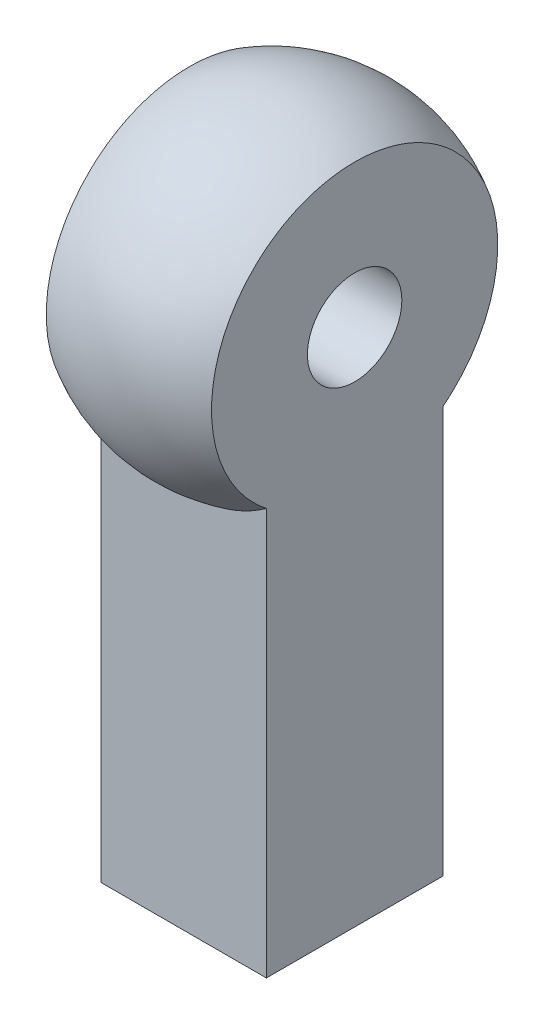
ISO-10303-21;
HEADER;
FILE_DESCRIPTION(('STEP AP214'),'2;1');
FILE_NAME('part.step','',(''),(''),'','','');
FILE_SCHEMA(('AUTOMOTIVE_DESIGN { 1 0 10303 214 1 1 1 1 }'));
ENDSEC;
DATA;
#1=APPLICATION_CONTEXT('core data for automotive mechanical design processes');
#2=APPLICATION_PROTOCOL_DEFINITION('international standard','automotive_design',2000,#1);
#3=PRODUCT_CONTEXT('',#1,'mechanical');
#4=PRODUCT('Part','Part','',(#3));
#5=PRODUCT_RELATED_PRODUCT_CATEGORY('part','',(#4));
#6=PRODUCT_DEFINITION_FORMATION('','',#4);
#7=PRODUCT_DEFINITION_CONTEXT('part definition',#1,'design');
#8=PRODUCT_DEFINITION('design','',#6,#7);
#9=PRODUCT_DEFINITION_SHAPE('','',#8);
#10=(LENGTH_UNIT() NAMED_UNIT(*) SI_UNIT(.MILLI.,.METRE.));
#11=(NAMED_UNIT(*) PLANE_ANGLE_UNIT() SI_UNIT($,.RADIAN.));
#12=(NAMED_UNIT(*) SI_UNIT($,.STERADIAN.) SOLID_ANGLE_UNIT());
#13=UNCERTAINTY_MEASURE_WITH_UNIT(LENGTH_MEASURE(1.E-05),#10,'distance_accuracy_value','');
#14=(GEOMETRIC_REPRESENTATION_CONTEXT(3) GLOBAL_UNCERTAINTY_ASSIGNED_CONTEXT((#13)) GLOBAL_UNIT_ASSIGNED_CONTEXT((#10,
#11,#12)) REPRESENTATION_CONTEXT('',''));
#15=CARTESIAN_POINT('',(0.,0.,0.));
#16=DIRECTION('',(0.,0.,1.));
#17=DIRECTION('',(1.,0.,0.));
#18=AXIS2_PLACEMENT_3D('',#15,#16,#17);
#19=CARTESIAN_POINT('',(0.,0.,0.));
#20=DIRECTION('',(0.,1.,0.));
#21=DIRECTION('',(0.,0.,-1.));
#22=AXIS2_PLACEMENT_3D('',#19,#20,#21);
#23=SPHERICAL_SURFACE('',#22,7.);
#24=CARTESIAN_POINT('',(0.,0.,3.7379727377111));
#25=DIRECTION('',(0.,0.,1.));
#26=DIRECTION('',(1.,0.,0.));
#27=AXIS2_PLACEMENT_3D('',#24,#25,#26);
#28=CIRCLE('',#27,5.91840855400577);
#29=CARTESIAN_POINT('',(3.5,-4.77258418596557,3.7379727377111));
#30=VERTEX_POINT('',#29);
#31=CARTESIAN_POINT('',(-3.5,-4.77258418596557,3.7379727377111));
#32=VERTEX_POINT('',#31);
#33=EDGE_CURVE('E110',#30,#32,#28,.F.);
#34=ORIENTED_EDGE('',*,*,#33,.F.);
#35=CARTESIAN_POINT('',(3.5,0.,0.));
#36=DIRECTION('',(1.,0.,0.));
#37=DIRECTION('',(0.,0.,-1.));
#38=AXIS2_PLACEMENT_3D('',#35,#36,#37);
#39=CIRCLE('',#38,6.06217782649107);
#40=CARTESIAN_POINT('',(3.5,-4.77258418596556,-3.7379727377111));
#41=VERTEX_POINT('',#40);
#42=EDGE_CURVE('E12',#30,#41,#39,.F.);
#43=ORIENTED_EDGE('',*,*,#42,.T.);
#44=CARTESIAN_POINT('',(0.,0.,-3.7379727377111));
#45=DIRECTION('',(0.,0.,-1.));
#46=DIRECTION('',(-1.,0.,0.));
#47=AXIS2_PLACEMENT_3D('',#44,#45,#46);
#48=CIRCLE('',#47,5.91840855400576);
#49=CARTESIAN_POINT('',(-3.5,-4.77258418596556,-3.7379727377111));
#50=VERTEX_POINT('',#49);
#51=EDGE_CURVE('E49',#50,#41,#48,.F.);
#52=ORIENTED_EDGE('',*,*,#51,.F.);
#53=CARTESIAN_POINT('',(-3.5,0.,0.));
#54=DIRECTION('',(-1.,0.,0.));
#55=DIRECTION('',(0.,0.,1.));
#56=AXIS2_PLACEMENT_3D('',#53,#54,#55);
#57=CIRCLE('',#56,6.06217782649107);
#58=EDGE_CURVE('E43',#50,#32,#57,.F.);
#59=ORIENTED_EDGE('',*,*,#58,.T.);
#60=EDGE_LOOP('',(#34,#43,#52,#59));
#61=FACE_BOUND('',#60,.T.);
#62=ADVANCED_FACE('F35',(#61),#23,.T.);
#63=CARTESIAN_POINT('',(-3.5,-29.4774502017861,-7.));
#64=DIRECTION('',(-1.,0.,0.));
#65=DIRECTION('',(0.,0.,1.));
#66=AXIS2_PLACEMENT_3D('',#63,#64,#65);
#67=PLANE('',#66);
#68=ORIENTED_EDGE('',*,*,#58,.F.);
#69=DIRECTION('',(0.,1.,0.));
#70=VECTOR('',#69,1.);
#71=CARTESIAN_POINT('',(-3.5,-4.24003846631764,-3.7379727377111));
#72=LINE('',#71,#70);
#73=CARTESIAN_POINT('',(-3.5,-22.,-3.7379727377111));
#74=VERTEX_POINT('',#73);
#75=EDGE_CURVE('E83',#74,#50,#72,.T.);
#76=ORIENTED_EDGE('',*,*,#75,.F.);
#77=DIRECTION('',(0.,0.,-1.));
#78=VECTOR('',#77,1.);
#79=CARTESIAN_POINT('',(-3.5,-22.,3.7379727377111));
#80=LINE('',#79,#78);
#81=CARTESIAN_POINT('',(-3.5,-22.,3.7379727377111));
#82=VERTEX_POINT('',#81);
#83=EDGE_CURVE('E80',#82,#74,#80,.T.);
#84=ORIENTED_EDGE('',*,*,#83,.F.);
#85=DIRECTION('',(0.,-1.,0.));
#86=VECTOR('',#85,1.);
#87=CARTESIAN_POINT('',(-3.5,-4.24003846631764,3.7379727377111));
#88=LINE('',#87,#86);
#89=EDGE_CURVE('E97',#32,#82,#88,.T.);
#90=ORIENTED_EDGE('',*,*,#89,.F.);
#91=EDGE_LOOP('',(#68,#76,#84,#90));
#92=FACE_BOUND('',#91,.T.);
#93=CARTESIAN_POINT('',(-3.5,0.,0.));
#94=DIRECTION('',(1.,0.,0.));
#95=DIRECTION('',(0.,0.,-1.));
#96=AXIS2_PLACEMENT_3D('',#93,#94,#95);
#97=CIRCLE('',#96,2.);
#98=CARTESIAN_POINT('',(-3.5,0.,-2.));
#99=VERTEX_POINT('',#98);
#100=EDGE_CURVE('E112',#99,#99,#97,.T.);
#101=ORIENTED_EDGE('',*,*,#100,.T.);
#102=EDGE_LOOP('',(#101));
#103=FACE_BOUND('',#102,.T.);
#104=ADVANCED_FACE('F121',(#92,#103),#67,.T.);
#105=CARTESIAN_POINT('',(3.5,-29.4774502017861,-7.));
#106=DIRECTION('',(1.,0.,0.));
#107=DIRECTION('',(0.,0.,-1.));
#108=AXIS2_PLACEMENT_3D('',#105,#106,#107);
#109=PLANE('',#108);
#110=ORIENTED_EDGE('',*,*,#42,.F.);
#111=DIRECTION('',(0.,-1.,0.));
#112=VECTOR('',#111,1.);
#113=CARTESIAN_POINT('',(3.5,-4.24003846631764,3.7379727377111));
#114=LINE('',#113,#112);
#115=CARTESIAN_POINT('',(3.5,-22.,3.7379727377111));
#116=VERTEX_POINT('',#115);
#117=EDGE_CURVE('E90',#30,#116,#114,.T.);
#118=ORIENTED_EDGE('',*,*,#117,.T.);
#119=DIRECTION('',(0.,0.,-1.));
#120=VECTOR('',#119,1.);
#121=CARTESIAN_POINT('',(3.5,-22.,3.7379727377111));
#122=LINE('',#121,#120);
#123=CARTESIAN_POINT('',(3.5,-22.,-3.7379727377111));
#124=VERTEX_POINT('',#123);
#125=EDGE_CURVE('E78',#116,#124,#122,.T.);
#126=ORIENTED_EDGE('',*,*,#125,.T.);
#127=DIRECTION('',(0.,1.,0.));
#128=VECTOR('',#127,1.);
#129=CARTESIAN_POINT('',(3.5,-4.24003846631764,-3.7379727377111));
#130=LINE('',#129,#128);
#131=EDGE_CURVE('E86',#124,#41,#130,.T.);
#132=ORIENTED_EDGE('',*,*,#131,.T.);
#133=EDGE_LOOP('',(#110,#118,#126,#132));
#134=FACE_BOUND('',#133,.T.);
#135=CARTESIAN_POINT('',(3.5,0.,0.));
#136=DIRECTION('',(1.,0.,0.));
#137=DIRECTION('',(0.,0.,-1.));
#138=AXIS2_PLACEMENT_3D('',#135,#136,#137);
#139=CIRCLE('',#138,2.);
#140=CARTESIAN_POINT('',(3.5,0.,-2.));
#141=VERTEX_POINT('',#140);
#142=EDGE_CURVE('E38',#141,#141,#139,.T.);
#143=ORIENTED_EDGE('',*,*,#142,.F.);
#144=EDGE_LOOP('',(#143));
#145=FACE_BOUND('',#144,.T.);
#146=ADVANCED_FACE('F93',(#134,#145),#109,.T.);
#147=CARTESIAN_POINT('',(-3.5,0.,0.));
#148=DIRECTION('',(1.,0.,0.));
#149=DIRECTION('',(0.,0.,-1.));
#150=AXIS2_PLACEMENT_3D('',#147,#148,#149);
#151=CYLINDRICAL_SURFACE('',#150,2.);
#152=ORIENTED_EDGE('',*,*,#142,.T.);
#153=EDGE_LOOP('',(#152));
#154=FACE_BOUND('',#153,.T.);
#155=ORIENTED_EDGE('',*,*,#100,.F.);
#156=EDGE_LOOP('',(#155));
#157=FACE_BOUND('',#156,.T.);
#158=ADVANCED_FACE('F118',(#154,#157),#151,.F.);
#159=CARTESIAN_POINT('',(-22.7693018666833,-4.24003846631764,3.7379727377111));
#160=DIRECTION('',(0.,0.,1.));
#161=DIRECTION('',(1.,0.,0.));
#162=AXIS2_PLACEMENT_3D('',#159,#160,#161);
#163=PLANE('',#162);
#164=ORIENTED_EDGE('',*,*,#117,.F.);
#165=ORIENTED_EDGE('',*,*,#33,.T.);
#166=ORIENTED_EDGE('',*,*,#89,.T.);
#167=DIRECTION('',(1.,0.,0.));
#168=VECTOR('',#167,1.);
#169=CARTESIAN_POINT('',(-22.7693018666833,-22.,3.7379727377111));
#170=LINE('',#169,#168);
#171=EDGE_CURVE('E99',#82,#116,#170,.T.);
#172=ORIENTED_EDGE('',*,*,#171,.T.);
#173=EDGE_LOOP('',(#164,#165,#166,#172));
#174=FACE_BOUND('',#173,.T.);
#175=ADVANCED_FACE('F126',(#174),#163,.T.);
#176=CARTESIAN_POINT('',(-22.7693018666833,-22.,3.7379727377111));
#177=DIRECTION('',(0.,-1.,0.));
#178=DIRECTION('',(0.,0.,-1.));
#179=AXIS2_PLACEMENT_3D('',#176,#177,#178);
#180=PLANE('',#179);
#181=CARTESIAN_POINT('',(0.,-22.,0.));
#182=DIRECTION('',(0.,-1.,0.));
#183=DIRECTION('',(0.,0.,-1.));
#184=AXIS2_PLACEMENT_3D('',#181,#182,#183);
#185=CIRCLE('',#184,2.);
#186=CARTESIAN_POINT('',(0.,-22.,-2.));
#187=VERTEX_POINT('',#186);
#188=EDGE_CURVE('E103',#187,#187,#185,.T.);
#189=ORIENTED_EDGE('',*,*,#188,.F.);
#190=EDGE_LOOP('',(#189));
#191=FACE_BOUND('',#190,.T.);
#192=ORIENTED_EDGE('',*,*,#171,.F.);
#193=ORIENTED_EDGE('',*,*,#83,.T.);
#194=DIRECTION('',(1.,0.,0.));
#195=VECTOR('',#194,1.);
#196=CARTESIAN_POINT('',(-22.7693018666833,-22.,-3.7379727377111));
#197=LINE('',#196,#195);
#198=EDGE_CURVE('E73',#74,#124,#197,.T.);
#199=ORIENTED_EDGE('',*,*,#198,.T.);
#200=ORIENTED_EDGE('',*,*,#125,.F.);
#201=EDGE_LOOP('',(#192,#193,#199,#200));
#202=FACE_BOUND('',#201,.T.);
#203=ADVANCED_FACE('F76',(#191,#202),#180,.T.);
#204=CARTESIAN_POINT('',(-22.7693018666833,-4.24003846631764,-3.7379727377111));
#205=DIRECTION('',(0.,0.,-1.));
#206=DIRECTION('',(-1.,0.,0.));
#207=AXIS2_PLACEMENT_3D('',#204,#205,#206);
#208=PLANE('',#207);
#209=ORIENTED_EDGE('',*,*,#75,.T.);
#210=ORIENTED_EDGE('',*,*,#51,.T.);
#211=ORIENTED_EDGE('',*,*,#131,.F.);
#212=ORIENTED_EDGE('',*,*,#198,.F.);
#213=EDGE_LOOP('',(#209,#210,#211,#212));
#214=FACE_BOUND('',#213,.T.);
#215=ADVANCED_FACE('F87',(#214),#208,.T.);
#216=CARTESIAN_POINT('',(0.,-7.,0.));
#217=DIRECTION('',(0.,-1.,0.));
#218=DIRECTION('',(0.,0.,-1.));
#219=AXIS2_PLACEMENT_3D('',#216,#217,#218);
#220=CYLINDRICAL_SURFACE('',#219,2.);
#221=CARTESIAN_POINT('',(0.,-7.,0.));
#222=DIRECTION('',(0.,-1.,0.));
#223=DIRECTION('',(0.,0.,-1.));
#224=AXIS2_PLACEMENT_3D('',#221,#222,#223);
#225=CIRCLE('',#224,2.);
#226=CARTESIAN_POINT('',(0.,-7.,-2.));
#227=VERTEX_POINT('',#226);
#228=EDGE_CURVE('E91',#227,#227,#225,.T.);
#229=ORIENTED_EDGE('',*,*,#228,.F.);
#230=EDGE_LOOP('',(#229));
#231=FACE_BOUND('',#230,.T.);
#232=ORIENTED_EDGE('',*,*,#188,.T.);
#233=EDGE_LOOP('',(#232));
#234=FACE_BOUND('',#233,.T.);
#235=ADVANCED_FACE('F147',(#231,#234),#220,.F.);
#236=CARTESIAN_POINT('',(0.,-7.,0.));
#237=DIRECTION('',(0.,-1.,0.));
#238=DIRECTION('',(0.,0.,-1.));
#239=AXIS2_PLACEMENT_3D('',#236,#237,#238);
#240=PLANE('',#239);
#241=ORIENTED_EDGE('',*,*,#228,.T.);
#242=EDGE_LOOP('',(#241));
#243=FACE_BOUND('',#242,.T.);
#244=ADVANCED_FACE('F150',(#243),#240,.T.);
#245=CLOSED_SHELL('',(#62,#104,#146,#158,#175,#203,#215,#235,#244));
#246=MANIFOLD_SOLID_BREP('B2',#245);
#247=ADVANCED_BREP_SHAPE_REPRESENTATION('',(#18,#246),#14);
#248=SHAPE_DEFINITION_REPRESENTATION(#9,#247);
ENDSEC;
END-ISO-10303-21;
